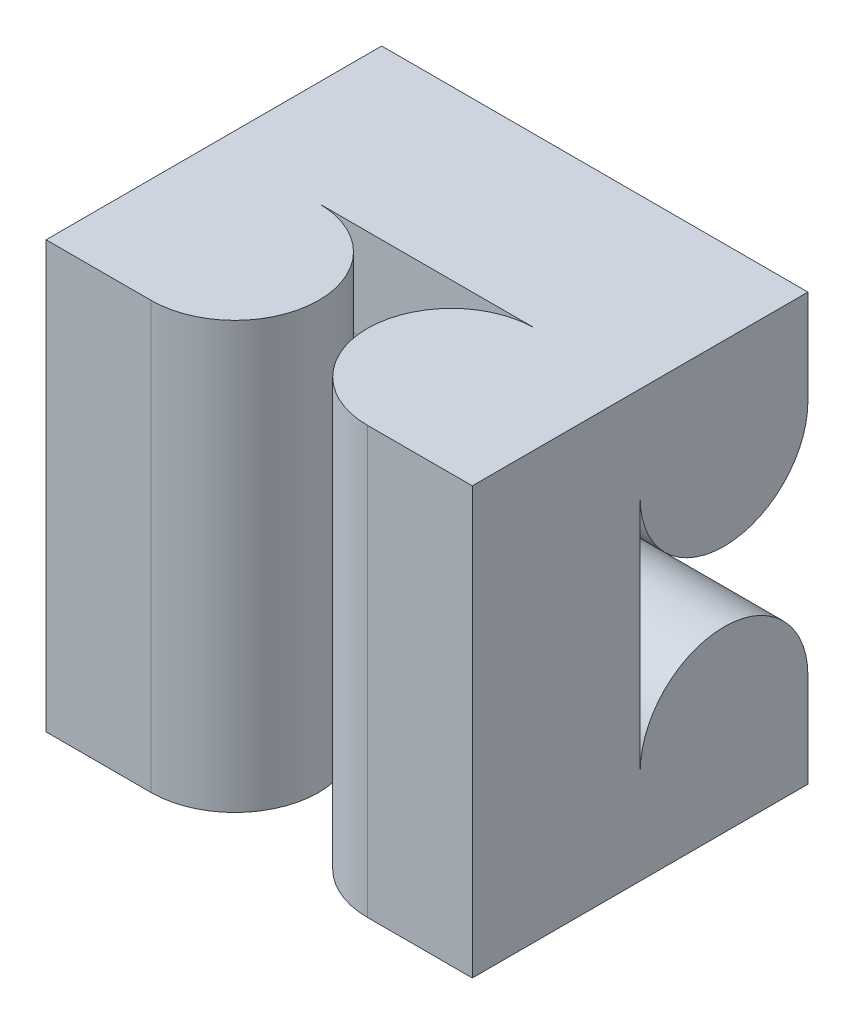
ISO-10303-21;
HEADER;
FILE_DESCRIPTION(('STEP AP214'),'2;1');
FILE_NAME('part.step','',(''),(''),'','','');
FILE_SCHEMA(('AUTOMOTIVE_DESIGN { 1 0 10303 214 1 1 1 1 }'));
ENDSEC;
DATA;
#1=APPLICATION_CONTEXT('core data for automotive mechanical design processes');
#2=APPLICATION_PROTOCOL_DEFINITION('international standard','automotive_design',2000,#1);
#3=PRODUCT_CONTEXT('',#1,'mechanical');
#4=PRODUCT('Part','Part','',(#3));
#5=PRODUCT_RELATED_PRODUCT_CATEGORY('part','',(#4));
#6=PRODUCT_DEFINITION_FORMATION('','',#4);
#7=PRODUCT_DEFINITION_CONTEXT('part definition',#1,'design');
#8=PRODUCT_DEFINITION('design','',#6,#7);
#9=PRODUCT_DEFINITION_SHAPE('','',#8);
#10=(LENGTH_UNIT() NAMED_UNIT(*) SI_UNIT(.MILLI.,.METRE.));
#11=(NAMED_UNIT(*) PLANE_ANGLE_UNIT() SI_UNIT($,.RADIAN.));
#12=(NAMED_UNIT(*) SI_UNIT($,.STERADIAN.) SOLID_ANGLE_UNIT());
#13=UNCERTAINTY_MEASURE_WITH_UNIT(LENGTH_MEASURE(1.E-05),#10,'distance_accuracy_value','');
#14=(GEOMETRIC_REPRESENTATION_CONTEXT(3) GLOBAL_UNCERTAINTY_ASSIGNED_CONTEXT((#13)) GLOBAL_UNIT_ASSIGNED_CONTEXT((#10,
#11,#12)) REPRESENTATION_CONTEXT('',''));
#15=CARTESIAN_POINT('',(0.,0.,0.));
#16=DIRECTION('',(0.,0.,1.));
#17=DIRECTION('',(1.,0.,0.));
#18=AXIS2_PLACEMENT_3D('',#15,#16,#17);
#19=CARTESIAN_POINT('',(0.129,0.508,-0.2));
#20=DIRECTION('',(0.,0.,1.));
#21=DIRECTION('',(1.,0.,0.));
#22=AXIS2_PLACEMENT_3D('',#19,#20,#21);
#23=PLANE('',#22);
#24=DIRECTION('',(-1.,0.,0.));
#25=VECTOR('',#24,1.);
#26=CARTESIAN_POINT('',(0.254,0.1125,-0.2));
#27=LINE('',#26,#25);
#28=CARTESIAN_POINT('',(0.254,0.1125,-0.2));
#29=VERTEX_POINT('',#28);
#30=CARTESIAN_POINT('',(0.129,0.1125,-0.2));
#31=VERTEX_POINT('',#30);
#32=EDGE_CURVE('E70',#29,#31,#27,.T.);
#33=ORIENTED_EDGE('',*,*,#32,.T.);
#34=DIRECTION('',(0.,-1.,0.));
#35=VECTOR('',#34,1.);
#36=CARTESIAN_POINT('',(0.129,0.508,-0.2));
#37=LINE('',#36,#35);
#38=CARTESIAN_POINT('',(0.129,0.3955,-0.2));
#39=VERTEX_POINT('',#38);
#40=EDGE_CURVE('E230',#39,#31,#37,.T.);
#41=ORIENTED_EDGE('',*,*,#40,.F.);
#42=DIRECTION('',(-1.,0.,0.));
#43=VECTOR('',#42,1.);
#44=CARTESIAN_POINT('',(0.254,0.3955,-0.2));
#45=LINE('',#44,#43);
#46=CARTESIAN_POINT('',(0.254,0.3955,-0.2));
#47=VERTEX_POINT('',#46);
#48=EDGE_CURVE('E218',#47,#39,#45,.T.);
#49=ORIENTED_EDGE('',*,*,#48,.F.);
#50=DIRECTION('',(0.,-1.,0.));
#51=VECTOR('',#50,1.);
#52=CARTESIAN_POINT('',(0.254,0.508,-0.2));
#53=LINE('',#52,#51);
#54=EDGE_CURVE('E65',#47,#29,#53,.T.);
#55=ORIENTED_EDGE('',*,*,#54,.T.);
#56=EDGE_LOOP('',(#33,#41,#49,#55));
#57=FACE_BOUND('',#56,.T.);
#58=ADVANCED_FACE('F49',(#57),#23,.F.);
#59=CARTESIAN_POINT('',(-0.129,0.508,-0.2));
#60=DIRECTION('',(0.,0.,1.));
#61=DIRECTION('',(1.,0.,0.));
#62=AXIS2_PLACEMENT_3D('',#59,#60,#61);
#63=PLANE('',#62);
#64=CARTESIAN_POINT('',(-0.129,0.1125,-0.2));
#65=VERTEX_POINT('',#64);
#66=CARTESIAN_POINT('',(-0.254,0.1125,-0.2));
#67=VERTEX_POINT('',#66);
#68=EDGE_CURVE('E256',#65,#67,#27,.T.);
#69=ORIENTED_EDGE('',*,*,#68,.T.);
#70=DIRECTION('',(0.,-1.,0.));
#71=VECTOR('',#70,1.);
#72=CARTESIAN_POINT('',(-0.254,0.508,-0.2));
#73=LINE('',#72,#71);
#74=CARTESIAN_POINT('',(-0.254,0.3955,-0.2));
#75=VERTEX_POINT('',#74);
#76=EDGE_CURVE('E176',#75,#67,#73,.T.);
#77=ORIENTED_EDGE('',*,*,#76,.F.);
#78=DIRECTION('',(-1.,0.,0.));
#79=VECTOR('',#78,1.);
#80=CARTESIAN_POINT('',(0.254,0.3955,-0.2));
#81=LINE('',#80,#79);
#82=CARTESIAN_POINT('',(-0.129,0.3955,-0.2));
#83=VERTEX_POINT('',#82);
#84=EDGE_CURVE('E282',#83,#75,#81,.T.);
#85=ORIENTED_EDGE('',*,*,#84,.F.);
#86=DIRECTION('',(0.,-1.,0.));
#87=VECTOR('',#86,1.);
#88=CARTESIAN_POINT('',(-0.129,0.508,-0.2));
#89=LINE('',#88,#87);
#90=EDGE_CURVE('E264',#83,#65,#89,.T.);
#91=ORIENTED_EDGE('',*,*,#90,.T.);
#92=EDGE_LOOP('',(#69,#77,#85,#91));
#93=FACE_BOUND('',#92,.T.);
#94=ADVANCED_FACE('F261',(#93),#63,.F.);
#95=CARTESIAN_POINT('',(0.254,0.3955,-0.2));
#96=DIRECTION('',(0.,0.,-1.));
#97=DIRECTION('',(-1.,0.,0.));
#98=AXIS2_PLACEMENT_3D('',#95,#96,#97);
#99=PLANE('',#98);
#100=CARTESIAN_POINT('',(-0.129,0.508,-0.2));
#101=VERTEX_POINT('',#100);
#102=EDGE_CURVE('E302',#101,#83,#89,.T.);
#103=ORIENTED_EDGE('',*,*,#102,.T.);
#104=EDGE_CURVE('E217',#39,#83,#45,.T.);
#105=ORIENTED_EDGE('',*,*,#104,.F.);
#106=CARTESIAN_POINT('',(0.129,0.508,-0.2));
#107=VERTEX_POINT('',#106);
#108=EDGE_CURVE('E236',#107,#39,#37,.T.);
#109=ORIENTED_EDGE('',*,*,#108,.F.);
#110=DIRECTION('',(-1.,0.,0.));
#111=VECTOR('',#110,1.);
#112=CARTESIAN_POINT('',(0.254,0.508,-0.2));
#113=LINE('',#112,#111);
#114=EDGE_CURVE('E205',#107,#101,#113,.T.);
#115=ORIENTED_EDGE('',*,*,#114,.T.);
#116=EDGE_LOOP('',(#103,#105,#109,#115));
#117=FACE_BOUND('',#116,.T.);
#118=ADVANCED_FACE('F328',(#117),#99,.F.);
#119=CARTESIAN_POINT('',(0.129,0.508,-0.1));
#120=DIRECTION('',(0.,-1.,0.));
#121=DIRECTION('',(0.,0.,-1.));
#122=AXIS2_PLACEMENT_3D('',#119,#120,#121);
#123=CYLINDRICAL_SURFACE('',#122,0.1);
#124=CARTESIAN_POINT('',(0.129,0.,-0.1));
#125=DIRECTION('',(0.,1.,0.));
#126=DIRECTION('',(0.,0.,-1.));
#127=AXIS2_PLACEMENT_3D('',#124,#125,#126);
#128=CIRCLE('',#127,0.1);
#129=CARTESIAN_POINT('',(0.129,0.,-0.2));
#130=VERTEX_POINT('',#129);
#131=CARTESIAN_POINT('',(0.129,0.,0.));
#132=VERTEX_POINT('',#131);
#133=EDGE_CURVE('E221',#130,#132,#128,.T.);
#134=ORIENTED_EDGE('',*,*,#133,.T.);
#135=DIRECTION('',(0.,-1.,0.));
#136=VECTOR('',#135,1.);
#137=CARTESIAN_POINT('',(0.129,0.508,0.));
#138=LINE('',#137,#136);
#139=CARTESIAN_POINT('',(0.129,0.508,0.));
#140=VERTEX_POINT('',#139);
#141=EDGE_CURVE('E12',#140,#132,#138,.T.);
#142=ORIENTED_EDGE('',*,*,#141,.F.);
#143=CARTESIAN_POINT('',(0.129,0.508,-0.1));
#144=DIRECTION('',(0.,1.,0.));
#145=DIRECTION('',(0.,0.,-1.));
#146=AXIS2_PLACEMENT_3D('',#143,#144,#145);
#147=CIRCLE('',#146,0.1);
#148=EDGE_CURVE('E222',#107,#140,#147,.T.);
#149=ORIENTED_EDGE('',*,*,#148,.F.);
#150=ORIENTED_EDGE('',*,*,#108,.T.);
#151=ORIENTED_EDGE('',*,*,#40,.T.);
#152=DIRECTION('',(0.,-1.,0.));
#153=VECTOR('',#152,1.);
#154=CARTESIAN_POINT('',(0.129,0.508,-0.2));
#155=LINE('',#154,#153);
#156=EDGE_CURVE('E180',#31,#130,#155,.T.);
#157=ORIENTED_EDGE('',*,*,#156,.T.);
#158=EDGE_LOOP('',(#134,#142,#149,#150,#151,#157));
#159=FACE_BOUND('',#158,.T.);
#160=ADVANCED_FACE('F51',(#159),#123,.T.);
#161=CARTESIAN_POINT('',(0.254,0.508,0.));
#162=DIRECTION('',(0.,0.,-1.));
#163=DIRECTION('',(-1.,0.,0.));
#164=AXIS2_PLACEMENT_3D('',#161,#162,#163);
#165=PLANE('',#164);
#166=DIRECTION('',(1.,0.,0.));
#167=VECTOR('',#166,1.);
#168=CARTESIAN_POINT('',(0.254,0.,0.));
#169=LINE('',#168,#167);
#170=CARTESIAN_POINT('',(0.254,0.,0.));
#171=VERTEX_POINT('',#170);
#172=EDGE_CURVE('E233',#132,#171,#169,.T.);
#173=ORIENTED_EDGE('',*,*,#172,.T.);
#174=DIRECTION('',(0.,-1.,0.));
#175=VECTOR('',#174,1.);
#176=CARTESIAN_POINT('',(0.254,0.508,0.));
#177=LINE('',#176,#175);
#178=CARTESIAN_POINT('',(0.254,0.508,0.));
#179=VERTEX_POINT('',#178);
#180=EDGE_CURVE('E58',#179,#171,#177,.T.);
#181=ORIENTED_EDGE('',*,*,#180,.F.);
#182=DIRECTION('',(1.,0.,0.));
#183=VECTOR('',#182,1.);
#184=CARTESIAN_POINT('',(0.254,0.508,0.));
#185=LINE('',#184,#183);
#186=EDGE_CURVE('E225',#140,#179,#185,.T.);
#187=ORIENTED_EDGE('',*,*,#186,.F.);
#188=ORIENTED_EDGE('',*,*,#141,.T.);
#189=EDGE_LOOP('',(#173,#181,#187,#188));
#190=FACE_BOUND('',#189,.T.);
#191=ADVANCED_FACE('F334',(#190),#165,.F.);
#192=CARTESIAN_POINT('',(0.254,0.508,-0.2));
#193=DIRECTION('',(-1.,0.,0.));
#194=DIRECTION('',(0.,0.,1.));
#195=AXIS2_PLACEMENT_3D('',#192,#193,#194);
#196=PLANE('',#195);
#197=DIRECTION('',(0.,0.,-1.));
#198=VECTOR('',#197,1.);
#199=CARTESIAN_POINT('',(0.254,0.,-0.2));
#200=LINE('',#199,#198);
#201=CARTESIAN_POINT('',(0.254,0.,-0.4));
#202=VERTEX_POINT('',#201);
#203=EDGE_CURVE('E226',#171,#202,#200,.T.);
#204=ORIENTED_EDGE('',*,*,#203,.T.);
#205=DIRECTION('',(0.,1.,0.));
#206=VECTOR('',#205,1.);
#207=CARTESIAN_POINT('',(0.254,0.,-0.4));
#208=LINE('',#207,#206);
#209=CARTESIAN_POINT('',(0.254,0.1125,-0.4));
#210=VERTEX_POINT('',#209);
#211=EDGE_CURVE('E171',#202,#210,#208,.T.);
#212=ORIENTED_EDGE('',*,*,#211,.T.);
#213=CARTESIAN_POINT('',(0.254,0.1125,-0.3));
#214=DIRECTION('',(1.,0.,0.));
#215=DIRECTION('',(0.,0.,-1.));
#216=AXIS2_PLACEMENT_3D('',#213,#214,#215);
#217=CIRCLE('',#216,0.1);
#218=EDGE_CURVE('E165',#210,#29,#217,.T.);
#219=ORIENTED_EDGE('',*,*,#218,.T.);
#220=ORIENTED_EDGE('',*,*,#54,.F.);
#221=CARTESIAN_POINT('',(0.254,0.3955,-0.3));
#222=DIRECTION('',(1.,0.,0.));
#223=DIRECTION('',(0.,0.,1.));
#224=AXIS2_PLACEMENT_3D('',#221,#222,#223);
#225=CIRCLE('',#224,0.1);
#226=CARTESIAN_POINT('',(0.254,0.3955,-0.4));
#227=VERTEX_POINT('',#226);
#228=EDGE_CURVE('E202',#47,#227,#225,.T.);
#229=ORIENTED_EDGE('',*,*,#228,.T.);
#230=DIRECTION('',(0.,1.,0.));
#231=VECTOR('',#230,1.);
#232=CARTESIAN_POINT('',(0.254,0.508,-0.4));
#233=LINE('',#232,#231);
#234=CARTESIAN_POINT('',(0.254,0.508,-0.4));
#235=VERTEX_POINT('',#234);
#236=EDGE_CURVE('E209',#227,#235,#233,.T.);
#237=ORIENTED_EDGE('',*,*,#236,.T.);
#238=DIRECTION('',(0.,0.,-1.));
#239=VECTOR('',#238,1.);
#240=CARTESIAN_POINT('',(0.254,0.508,-0.2));
#241=LINE('',#240,#239);
#242=EDGE_CURVE('E228',#179,#235,#241,.T.);
#243=ORIENTED_EDGE('',*,*,#242,.F.);
#244=ORIENTED_EDGE('',*,*,#180,.T.);
#245=EDGE_LOOP('',(#204,#212,#219,#220,#229,#237,#243,#244));
#246=FACE_BOUND('',#245,.T.);
#247=ADVANCED_FACE('F244',(#246),#196,.F.);
#248=CARTESIAN_POINT('',(0.129,0.508,-0.1));
#249=DIRECTION('',(0.,-1.,0.));
#250=DIRECTION('',(0.,0.,-1.));
#251=AXIS2_PLACEMENT_3D('',#248,#249,#250);
#252=PLANE('',#251);
#253=ORIENTED_EDGE('',*,*,#148,.T.);
#254=ORIENTED_EDGE('',*,*,#186,.T.);
#255=ORIENTED_EDGE('',*,*,#242,.T.);
#256=DIRECTION('',(-1.,0.,0.));
#257=VECTOR('',#256,1.);
#258=CARTESIAN_POINT('',(0.254,0.508,-0.4));
#259=LINE('',#258,#257);
#260=CARTESIAN_POINT('',(-0.254,0.508,-0.4));
#261=VERTEX_POINT('',#260);
#262=EDGE_CURVE('E208',#235,#261,#259,.T.);
#263=ORIENTED_EDGE('',*,*,#262,.T.);
#264=DIRECTION('',(0.,0.,1.));
#265=VECTOR('',#264,1.);
#266=CARTESIAN_POINT('',(-0.254,0.508,-0.2));
#267=LINE('',#266,#265);
#268=CARTESIAN_POINT('',(-0.254,0.508,0.));
#269=VERTEX_POINT('',#268);
#270=EDGE_CURVE('E198',#261,#269,#267,.T.);
#271=ORIENTED_EDGE('',*,*,#270,.T.);
#272=DIRECTION('',(1.,0.,0.));
#273=VECTOR('',#272,1.);
#274=CARTESIAN_POINT('',(-0.254,0.508,0.));
#275=LINE('',#274,#273);
#276=CARTESIAN_POINT('',(-0.129,0.508,0.));
#277=VERTEX_POINT('',#276);
#278=EDGE_CURVE('E294',#269,#277,#275,.T.);
#279=ORIENTED_EDGE('',*,*,#278,.T.);
#280=CARTESIAN_POINT('',(-0.129,0.508,-0.1));
#281=DIRECTION('',(0.,1.,0.));
#282=DIRECTION('',(0.,0.,1.));
#283=AXIS2_PLACEMENT_3D('',#280,#281,#282);
#284=CIRCLE('',#283,0.1);
#285=EDGE_CURVE('E292',#277,#101,#284,.T.);
#286=ORIENTED_EDGE('',*,*,#285,.T.);
#287=ORIENTED_EDGE('',*,*,#114,.F.);
#288=EDGE_LOOP('',(#253,#254,#255,#263,#271,#279,#286,#287));
#289=FACE_BOUND('',#288,.T.);
#290=ADVANCED_FACE('F311',(#289),#252,.F.);
#291=CARTESIAN_POINT('',(0.129,0.,-0.1));
#292=DIRECTION('',(0.,-1.,0.));
#293=DIRECTION('',(0.,0.,-1.));
#294=AXIS2_PLACEMENT_3D('',#291,#292,#293);
#295=PLANE('',#294);
#296=ORIENTED_EDGE('',*,*,#133,.F.);
#297=DIRECTION('',(-1.,0.,0.));
#298=VECTOR('',#297,1.);
#299=CARTESIAN_POINT('',(0.254,0.,-0.2));
#300=LINE('',#299,#298);
#301=CARTESIAN_POINT('',(-0.129,0.,-0.2));
#302=VERTEX_POINT('',#301);
#303=EDGE_CURVE('E250',#130,#302,#300,.T.);
#304=ORIENTED_EDGE('',*,*,#303,.T.);
#305=CARTESIAN_POINT('',(-0.129,0.,-0.1));
#306=DIRECTION('',(0.,1.,0.));
#307=DIRECTION('',(0.,0.,1.));
#308=AXIS2_PLACEMENT_3D('',#305,#306,#307);
#309=CIRCLE('',#308,0.1);
#310=CARTESIAN_POINT('',(-0.129,0.,0.));
#311=VERTEX_POINT('',#310);
#312=EDGE_CURVE('E288',#311,#302,#309,.T.);
#313=ORIENTED_EDGE('',*,*,#312,.F.);
#314=DIRECTION('',(1.,0.,0.));
#315=VECTOR('',#314,1.);
#316=CARTESIAN_POINT('',(-0.254,0.,0.));
#317=LINE('',#316,#315);
#318=CARTESIAN_POINT('',(-0.254,0.,0.));
#319=VERTEX_POINT('',#318);
#320=EDGE_CURVE('E285',#319,#311,#317,.T.);
#321=ORIENTED_EDGE('',*,*,#320,.F.);
#322=DIRECTION('',(0.,0.,1.));
#323=VECTOR('',#322,1.);
#324=CARTESIAN_POINT('',(-0.254,0.,-0.2));
#325=LINE('',#324,#323);
#326=CARTESIAN_POINT('',(-0.254,0.,-0.4));
#327=VERTEX_POINT('',#326);
#328=EDGE_CURVE('E249',#327,#319,#325,.T.);
#329=ORIENTED_EDGE('',*,*,#328,.F.);
#330=DIRECTION('',(-1.,0.,0.));
#331=VECTOR('',#330,1.);
#332=CARTESIAN_POINT('',(0.254,0.,-0.4));
#333=LINE('',#332,#331);
#334=EDGE_CURVE('E160',#202,#327,#333,.T.);
#335=ORIENTED_EDGE('',*,*,#334,.F.);
#336=ORIENTED_EDGE('',*,*,#203,.F.);
#337=ORIENTED_EDGE('',*,*,#172,.F.);
#338=EDGE_LOOP('',(#296,#304,#313,#321,#329,#335,#336,#337));
#339=FACE_BOUND('',#338,.T.);
#340=ADVANCED_FACE('F248',(#339),#295,.T.);
#341=CARTESIAN_POINT('',(0.254,0.3955,-0.3));
#342=DIRECTION('',(-1.,0.,0.));
#343=DIRECTION('',(0.,0.,1.));
#344=AXIS2_PLACEMENT_3D('',#341,#342,#343);
#345=CYLINDRICAL_SURFACE('',#344,0.1);
#346=CARTESIAN_POINT('',(-0.254,0.3955,-0.3));
#347=DIRECTION('',(1.,0.,0.));
#348=DIRECTION('',(0.,0.,1.));
#349=AXIS2_PLACEMENT_3D('',#346,#347,#348);
#350=CIRCLE('',#349,0.1);
#351=CARTESIAN_POINT('',(-0.254,0.3955,-0.4));
#352=VERTEX_POINT('',#351);
#353=EDGE_CURVE('E284',#75,#352,#350,.T.);
#354=ORIENTED_EDGE('',*,*,#353,.T.);
#355=DIRECTION('',(-1.,0.,0.));
#356=VECTOR('',#355,1.);
#357=CARTESIAN_POINT('',(0.254,0.3955,-0.4));
#358=LINE('',#357,#356);
#359=EDGE_CURVE('E214',#227,#352,#358,.T.);
#360=ORIENTED_EDGE('',*,*,#359,.F.);
#361=ORIENTED_EDGE('',*,*,#228,.F.);
#362=ORIENTED_EDGE('',*,*,#48,.T.);
#363=ORIENTED_EDGE('',*,*,#104,.T.);
#364=ORIENTED_EDGE('',*,*,#84,.T.);
#365=EDGE_LOOP('',(#354,#360,#361,#362,#363,#364));
#366=FACE_BOUND('',#365,.T.);
#367=ADVANCED_FACE('F275',(#366),#345,.T.);
#368=CARTESIAN_POINT('',(0.254,0.508,-0.4));
#369=DIRECTION('',(0.,0.,1.));
#370=DIRECTION('',(1.,0.,0.));
#371=AXIS2_PLACEMENT_3D('',#368,#369,#370);
#372=PLANE('',#371);
#373=DIRECTION('',(0.,1.,0.));
#374=VECTOR('',#373,1.);
#375=CARTESIAN_POINT('',(-0.254,0.508,-0.4));
#376=LINE('',#375,#374);
#377=EDGE_CURVE('E203',#352,#261,#376,.T.);
#378=ORIENTED_EDGE('',*,*,#377,.T.);
#379=ORIENTED_EDGE('',*,*,#262,.F.);
#380=ORIENTED_EDGE('',*,*,#236,.F.);
#381=ORIENTED_EDGE('',*,*,#359,.T.);
#382=EDGE_LOOP('',(#378,#379,#380,#381));
#383=FACE_BOUND('',#382,.T.);
#384=ADVANCED_FACE('F314',(#383),#372,.F.);
#385=CARTESIAN_POINT('',(-0.254,0.3955,-0.3));
#386=DIRECTION('',(-1.,0.,0.));
#387=DIRECTION('',(0.,0.,1.));
#388=AXIS2_PLACEMENT_3D('',#385,#386,#387);
#389=PLANE('',#388);
#390=ORIENTED_EDGE('',*,*,#353,.F.);
#391=ORIENTED_EDGE('',*,*,#76,.T.);
#392=CARTESIAN_POINT('',(-0.254,0.1125,-0.3));
#393=DIRECTION('',(1.,0.,0.));
#394=DIRECTION('',(0.,0.,-1.));
#395=AXIS2_PLACEMENT_3D('',#392,#393,#394);
#396=CIRCLE('',#395,0.1);
#397=CARTESIAN_POINT('',(-0.254,0.1125,-0.4));
#398=VERTEX_POINT('',#397);
#399=EDGE_CURVE('E164',#398,#67,#396,.T.);
#400=ORIENTED_EDGE('',*,*,#399,.F.);
#401=DIRECTION('',(0.,1.,0.));
#402=VECTOR('',#401,1.);
#403=CARTESIAN_POINT('',(-0.254,0.,-0.4));
#404=LINE('',#403,#402);
#405=EDGE_CURVE('E153',#327,#398,#404,.T.);
#406=ORIENTED_EDGE('',*,*,#405,.F.);
#407=ORIENTED_EDGE('',*,*,#328,.T.);
#408=DIRECTION('',(0.,-1.,0.));
#409=VECTOR('',#408,1.);
#410=CARTESIAN_POINT('',(-0.254,0.508,0.));
#411=LINE('',#410,#409);
#412=EDGE_CURVE('E187',#269,#319,#411,.T.);
#413=ORIENTED_EDGE('',*,*,#412,.F.);
#414=ORIENTED_EDGE('',*,*,#270,.F.);
#415=ORIENTED_EDGE('',*,*,#377,.F.);
#416=EDGE_LOOP('',(#390,#391,#400,#406,#407,#413,#414,#415));
#417=FACE_BOUND('',#416,.T.);
#418=ADVANCED_FACE('F174',(#417),#389,.T.);
#419=CARTESIAN_POINT('',(-0.254,0.508,0.));
#420=DIRECTION('',(0.,0.,-1.));
#421=DIRECTION('',(-1.,0.,0.));
#422=AXIS2_PLACEMENT_3D('',#419,#420,#421);
#423=PLANE('',#422);
#424=ORIENTED_EDGE('',*,*,#320,.T.);
#425=DIRECTION('',(0.,-1.,0.));
#426=VECTOR('',#425,1.);
#427=CARTESIAN_POINT('',(-0.129,0.508,0.));
#428=LINE('',#427,#426);
#429=EDGE_CURVE('E191',#277,#311,#428,.T.);
#430=ORIENTED_EDGE('',*,*,#429,.F.);
#431=ORIENTED_EDGE('',*,*,#278,.F.);
#432=ORIENTED_EDGE('',*,*,#412,.T.);
#433=EDGE_LOOP('',(#424,#430,#431,#432));
#434=FACE_BOUND('',#433,.T.);
#435=ADVANCED_FACE('F308',(#434),#423,.F.);
#436=CARTESIAN_POINT('',(-0.129,0.508,-0.1));
#437=DIRECTION('',(0.,-1.,0.));
#438=DIRECTION('',(0.,0.,-1.));
#439=AXIS2_PLACEMENT_3D('',#436,#437,#438);
#440=CYLINDRICAL_SURFACE('',#439,0.1);
#441=ORIENTED_EDGE('',*,*,#312,.T.);
#442=DIRECTION('',(0.,-1.,0.));
#443=VECTOR('',#442,1.);
#444=CARTESIAN_POINT('',(-0.129,0.508,-0.2));
#445=LINE('',#444,#443);
#446=EDGE_CURVE('E177',#65,#302,#445,.T.);
#447=ORIENTED_EDGE('',*,*,#446,.F.);
#448=ORIENTED_EDGE('',*,*,#90,.F.);
#449=ORIENTED_EDGE('',*,*,#102,.F.);
#450=ORIENTED_EDGE('',*,*,#285,.F.);
#451=ORIENTED_EDGE('',*,*,#429,.T.);
#452=EDGE_LOOP('',(#441,#447,#448,#449,#450,#451));
#453=FACE_BOUND('',#452,.T.);
#454=ADVANCED_FACE('F306',(#453),#440,.T.);
#455=CARTESIAN_POINT('',(0.254,0.1125,-0.2));
#456=DIRECTION('',(0.,0.,-1.));
#457=DIRECTION('',(-1.,0.,0.));
#458=AXIS2_PLACEMENT_3D('',#455,#456,#457);
#459=PLANE('',#458);
#460=ORIENTED_EDGE('',*,*,#156,.F.);
#461=EDGE_CURVE('E254',#31,#65,#27,.T.);
#462=ORIENTED_EDGE('',*,*,#461,.T.);
#463=ORIENTED_EDGE('',*,*,#446,.T.);
#464=ORIENTED_EDGE('',*,*,#303,.F.);
#465=EDGE_LOOP('',(#460,#462,#463,#464));
#466=FACE_BOUND('',#465,.T.);
#467=ADVANCED_FACE('F267',(#466),#459,.F.);
#468=CARTESIAN_POINT('',(0.254,0.1125,-0.3));
#469=DIRECTION('',(-1.,0.,0.));
#470=DIRECTION('',(0.,0.,1.));
#471=AXIS2_PLACEMENT_3D('',#468,#469,#470);
#472=CYLINDRICAL_SURFACE('',#471,0.1);
#473=ORIENTED_EDGE('',*,*,#399,.T.);
#474=ORIENTED_EDGE('',*,*,#68,.F.);
#475=ORIENTED_EDGE('',*,*,#461,.F.);
#476=ORIENTED_EDGE('',*,*,#32,.F.);
#477=ORIENTED_EDGE('',*,*,#218,.F.);
#478=DIRECTION('',(-1.,0.,0.));
#479=VECTOR('',#478,1.);
#480=CARTESIAN_POINT('',(0.254,0.1125,-0.4));
#481=LINE('',#480,#479);
#482=EDGE_CURVE('E157',#210,#398,#481,.T.);
#483=ORIENTED_EDGE('',*,*,#482,.T.);
#484=EDGE_LOOP('',(#473,#474,#475,#476,#477,#483));
#485=FACE_BOUND('',#484,.T.);
#486=ADVANCED_FACE('F169',(#485),#472,.T.);
#487=CARTESIAN_POINT('',(0.254,0.,-0.4));
#488=DIRECTION('',(0.,0.,1.));
#489=DIRECTION('',(1.,0.,0.));
#490=AXIS2_PLACEMENT_3D('',#487,#488,#489);
#491=PLANE('',#490);
#492=ORIENTED_EDGE('',*,*,#405,.T.);
#493=ORIENTED_EDGE('',*,*,#482,.F.);
#494=ORIENTED_EDGE('',*,*,#211,.F.);
#495=ORIENTED_EDGE('',*,*,#334,.T.);
#496=EDGE_LOOP('',(#492,#493,#494,#495));
#497=FACE_BOUND('',#496,.T.);
#498=ADVANCED_FACE('F155',(#497),#491,.F.);
#499=CLOSED_SHELL('',(#58,#94,#118,#160,#191,#247,#290,#340,#367,#384,#418,#435,#454,#467,#486,#498));
#500=MANIFOLD_SOLID_BREP('B2',#499);
#501=ADVANCED_BREP_SHAPE_REPRESENTATION('',(#18,#500),#14);
#502=SHAPE_DEFINITION_REPRESENTATION(#9,#501);
ENDSEC;
END-ISO-10303-21;
